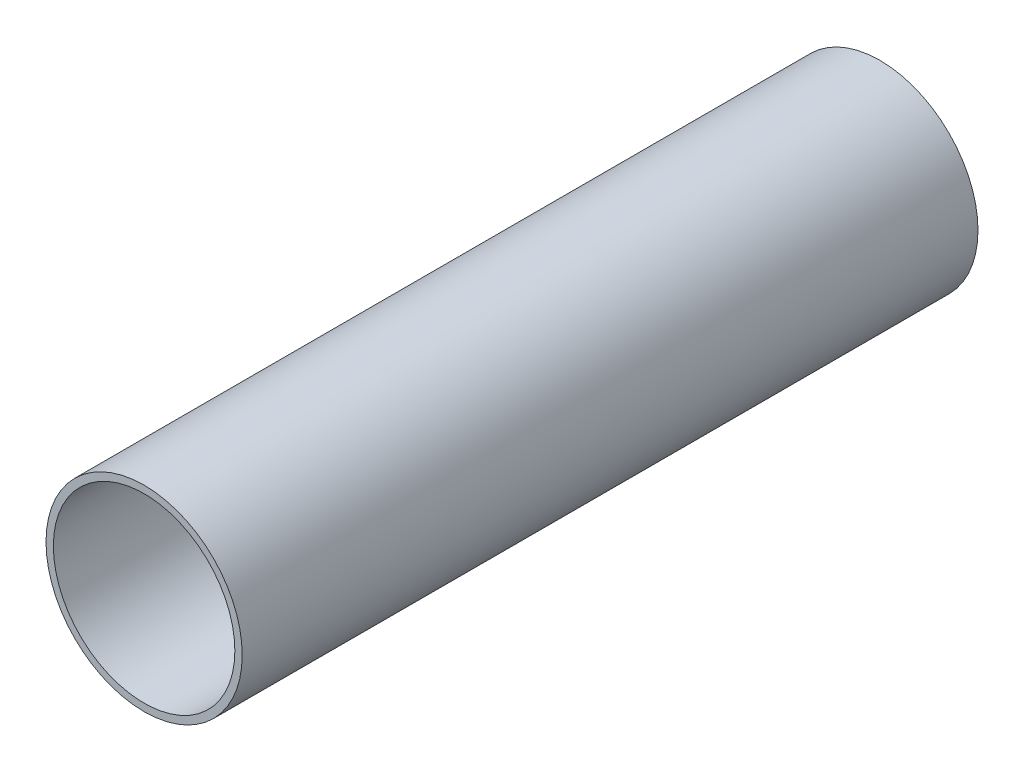
ISO-10303-21;
HEADER;
FILE_DESCRIPTION(('STEP AP214'),'2;1');
FILE_NAME('part.step','',(''),(''),'','','');
FILE_SCHEMA(('AUTOMOTIVE_DESIGN { 1 0 10303 214 1 1 1 1 }'));
ENDSEC;
DATA;
#1=APPLICATION_CONTEXT('core data for automotive mechanical design processes');
#2=APPLICATION_PROTOCOL_DEFINITION('international standard','automotive_design',2000,#1);
#3=PRODUCT_CONTEXT('',#1,'mechanical');
#4=PRODUCT('Part','Part','',(#3));
#5=PRODUCT_RELATED_PRODUCT_CATEGORY('part','',(#4));
#6=PRODUCT_DEFINITION_FORMATION('','',#4);
#7=PRODUCT_DEFINITION_CONTEXT('part definition',#1,'design');
#8=PRODUCT_DEFINITION('design','',#6,#7);
#9=PRODUCT_DEFINITION_SHAPE('','',#8);
#10=(LENGTH_UNIT() NAMED_UNIT(*) SI_UNIT(.MILLI.,.METRE.));
#11=(NAMED_UNIT(*) PLANE_ANGLE_UNIT() SI_UNIT($,.RADIAN.));
#12=(NAMED_UNIT(*) SI_UNIT($,.STERADIAN.) SOLID_ANGLE_UNIT());
#13=UNCERTAINTY_MEASURE_WITH_UNIT(LENGTH_MEASURE(1.E-05),#10,'distance_accuracy_value','');
#14=(GEOMETRIC_REPRESENTATION_CONTEXT(3) GLOBAL_UNCERTAINTY_ASSIGNED_CONTEXT((#13)) GLOBAL_UNIT_ASSIGNED_CONTEXT((#10,
#11,#12)) REPRESENTATION_CONTEXT('',''));
#15=CARTESIAN_POINT('',(0.,0.,0.));
#16=DIRECTION('',(0.,0.,1.));
#17=DIRECTION('',(1.,0.,0.));
#18=AXIS2_PLACEMENT_3D('',#15,#16,#17);
#19=CARTESIAN_POINT('',(0.,0.,150.));
#20=DIRECTION('',(0.,0.,1.));
#21=DIRECTION('',(1.,0.,0.));
#22=AXIS2_PLACEMENT_3D('',#19,#20,#21);
#23=PLANE('',#22);
#24=CARTESIAN_POINT('',(0.,0.,150.));
#25=DIRECTION('',(0.,0.,1.));
#26=DIRECTION('',(1.,0.,0.));
#27=AXIS2_PLACEMENT_3D('',#24,#25,#26);
#28=CIRCLE('',#27,20.);
#29=CARTESIAN_POINT('',(20.,0.,150.));
#30=VERTEX_POINT('',#29);
#31=EDGE_CURVE('E10',#30,#30,#28,.T.);
#32=ORIENTED_EDGE('',*,*,#31,.T.);
#33=EDGE_LOOP('',(#32));
#34=FACE_BOUND('',#33,.T.);
#35=CARTESIAN_POINT('',(0.,0.,150.));
#36=DIRECTION('',(0.,0.,1.));
#37=DIRECTION('',(1.,0.,0.));
#38=AXIS2_PLACEMENT_3D('',#35,#36,#37);
#39=CIRCLE('',#38,18.5);
#40=CARTESIAN_POINT('',(18.5,0.,150.));
#41=VERTEX_POINT('',#40);
#42=EDGE_CURVE('E54',#41,#41,#39,.T.);
#43=ORIENTED_EDGE('',*,*,#42,.F.);
#44=EDGE_LOOP('',(#43));
#45=FACE_BOUND('',#44,.T.);
#46=ADVANCED_FACE('F41',(#34,#45),#23,.T.);
#47=CARTESIAN_POINT('',(0.,0.,0.));
#48=DIRECTION('',(0.,0.,1.));
#49=DIRECTION('',(1.,0.,0.));
#50=AXIS2_PLACEMENT_3D('',#47,#48,#49);
#51=PLANE('',#50);
#52=CARTESIAN_POINT('',(0.,0.,0.));
#53=DIRECTION('',(0.,0.,1.));
#54=DIRECTION('',(1.,0.,0.));
#55=AXIS2_PLACEMENT_3D('',#52,#53,#54);
#56=CIRCLE('',#55,20.);
#57=CARTESIAN_POINT('',(20.,0.,0.));
#58=VERTEX_POINT('',#57);
#59=EDGE_CURVE('E45',#58,#58,#56,.T.);
#60=ORIENTED_EDGE('',*,*,#59,.F.);
#61=EDGE_LOOP('',(#60));
#62=FACE_BOUND('',#61,.T.);
#63=CARTESIAN_POINT('',(0.,0.,0.));
#64=DIRECTION('',(0.,0.,1.));
#65=DIRECTION('',(1.,0.,0.));
#66=AXIS2_PLACEMENT_3D('',#63,#64,#65);
#67=CIRCLE('',#66,18.5);
#68=CARTESIAN_POINT('',(18.5,0.,0.));
#69=VERTEX_POINT('',#68);
#70=EDGE_CURVE('E56',#69,#69,#67,.T.);
#71=ORIENTED_EDGE('',*,*,#70,.T.);
#72=EDGE_LOOP('',(#71));
#73=FACE_BOUND('',#72,.T.);
#74=ADVANCED_FACE('F68',(#62,#73),#51,.F.);
#75=CARTESIAN_POINT('',(0.,0.,150.));
#76=DIRECTION('',(0.,0.,-1.));
#77=DIRECTION('',(-1.,0.,0.));
#78=AXIS2_PLACEMENT_3D('',#75,#76,#77);
#79=CYLINDRICAL_SURFACE('',#78,20.);
#80=ORIENTED_EDGE('',*,*,#31,.F.);
#81=EDGE_LOOP('',(#80));
#82=FACE_BOUND('',#81,.T.);
#83=ORIENTED_EDGE('',*,*,#59,.T.);
#84=EDGE_LOOP('',(#83));
#85=FACE_BOUND('',#84,.T.);
#86=ADVANCED_FACE('F43',(#82,#85),#79,.T.);
#87=CARTESIAN_POINT('',(0.,0.,150.));
#88=DIRECTION('',(0.,0.,-1.));
#89=DIRECTION('',(-1.,0.,0.));
#90=AXIS2_PLACEMENT_3D('',#87,#88,#89);
#91=CYLINDRICAL_SURFACE('',#90,18.5);
#92=ORIENTED_EDGE('',*,*,#42,.T.);
#93=EDGE_LOOP('',(#92));
#94=FACE_BOUND('',#93,.T.);
#95=ORIENTED_EDGE('',*,*,#70,.F.);
#96=EDGE_LOOP('',(#95));
#97=FACE_BOUND('',#96,.T.);
#98=ADVANCED_FACE('F64',(#94,#97),#91,.F.);
#99=CLOSED_SHELL('',(#46,#74,#86,#98));
#100=MANIFOLD_SOLID_BREP('B2',#99);
#101=ADVANCED_BREP_SHAPE_REPRESENTATION('',(#18,#100),#14);
#102=SHAPE_DEFINITION_REPRESENTATION(#9,#101);
ENDSEC;
END-ISO-10303-21;
